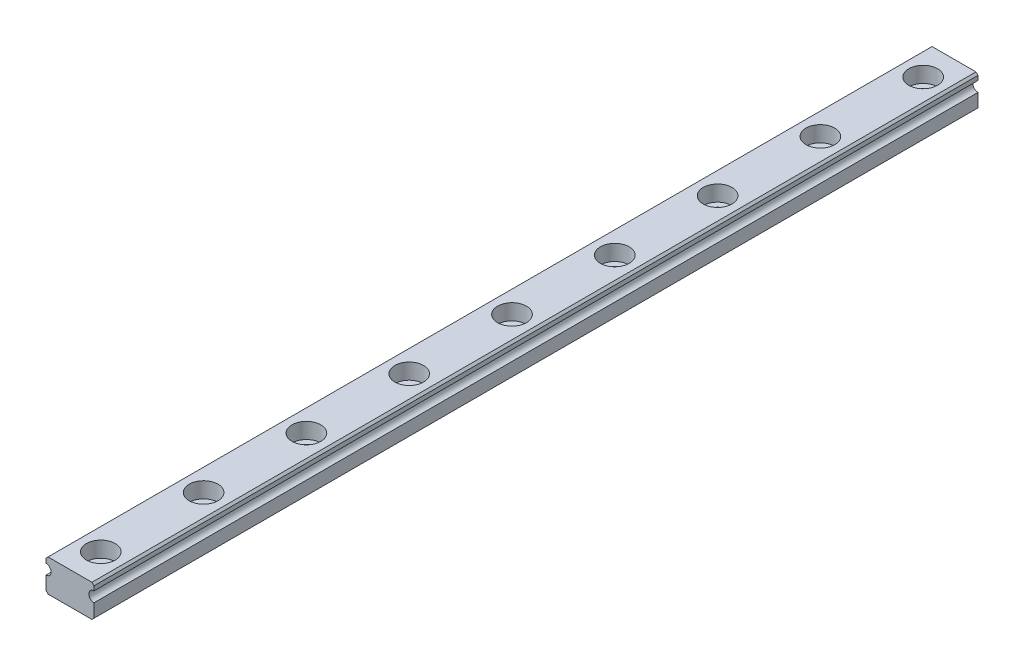
ISO-10303-21;
HEADER;
FILE_DESCRIPTION(('STEP AP214'),'2;1');
FILE_NAME('part.step','',(''),(''),'','','');
FILE_SCHEMA(('AUTOMOTIVE_DESIGN { 1 0 10303 214 1 1 1 1 }'));
ENDSEC;
DATA;
#1=APPLICATION_CONTEXT('core data for automotive mechanical design processes');
#2=APPLICATION_PROTOCOL_DEFINITION('international standard','automotive_design',2000,#1);
#3=PRODUCT_CONTEXT('',#1,'mechanical');
#4=PRODUCT('Part','Part','',(#3));
#5=PRODUCT_RELATED_PRODUCT_CATEGORY('part','',(#4));
#6=PRODUCT_DEFINITION_FORMATION('','',#4);
#7=PRODUCT_DEFINITION_CONTEXT('part definition',#1,'design');
#8=PRODUCT_DEFINITION('design','',#6,#7);
#9=PRODUCT_DEFINITION_SHAPE('','',#8);
#10=(LENGTH_UNIT() NAMED_UNIT(*) SI_UNIT(.MILLI.,.METRE.));
#11=(NAMED_UNIT(*) PLANE_ANGLE_UNIT() SI_UNIT($,.RADIAN.));
#12=(NAMED_UNIT(*) SI_UNIT($,.STERADIAN.) SOLID_ANGLE_UNIT());
#13=UNCERTAINTY_MEASURE_WITH_UNIT(LENGTH_MEASURE(1.E-05),#10,'distance_accuracy_value','');
#14=(GEOMETRIC_REPRESENTATION_CONTEXT(3) GLOBAL_UNCERTAINTY_ASSIGNED_CONTEXT((#13)) GLOBAL_UNIT_ASSIGNED_CONTEXT((#10,
#11,#12)) REPRESENTATION_CONTEXT('',''));
#15=CARTESIAN_POINT('',(0.,0.,0.));
#16=DIRECTION('',(0.,0.,1.));
#17=DIRECTION('',(1.,0.,0.));
#18=AXIS2_PLACEMENT_3D('',#15,#16,#17);
#19=CARTESIAN_POINT('',(-3.2,0.,129.));
#20=DIRECTION('',(0.,1.,0.));
#21=DIRECTION('',(0.,0.,1.));
#22=AXIS2_PLACEMENT_3D('',#19,#20,#21);
#23=PLANE('',#22);
#24=CARTESIAN_POINT('',(0.,0.,34.5));
#25=DIRECTION('',(0.,1.,0.));
#26=DIRECTION('',(0.,0.,1.));
#27=AXIS2_PLACEMENT_3D('',#24,#25,#26);
#28=CIRCLE('',#27,1.2);
#29=CARTESIAN_POINT('',(0.,0.,35.7));
#30=VERTEX_POINT('',#29);
#31=EDGE_CURVE('E267',#30,#30,#28,.T.);
#32=ORIENTED_EDGE('',*,*,#31,.T.);
#33=EDGE_LOOP('',(#32));
#34=FACE_BOUND('',#33,.T.);
#35=CARTESIAN_POINT('',(0.,0.,64.5));
#36=DIRECTION('',(0.,1.,0.));
#37=DIRECTION('',(0.,0.,1.));
#38=AXIS2_PLACEMENT_3D('',#35,#36,#37);
#39=CIRCLE('',#38,1.20000000000001);
#40=CARTESIAN_POINT('',(0.,0.,65.7));
#41=VERTEX_POINT('',#40);
#42=EDGE_CURVE('E296',#41,#41,#39,.T.);
#43=ORIENTED_EDGE('',*,*,#42,.T.);
#44=EDGE_LOOP('',(#43));
#45=FACE_BOUND('',#44,.T.);
#46=CARTESIAN_POINT('',(0.,0.,94.5));
#47=DIRECTION('',(0.,1.,0.));
#48=DIRECTION('',(0.,0.,1.));
#49=AXIS2_PLACEMENT_3D('',#46,#47,#48);
#50=CIRCLE('',#49,1.20000000000001);
#51=CARTESIAN_POINT('',(0.,0.,95.7));
#52=VERTEX_POINT('',#51);
#53=EDGE_CURVE('E318',#52,#52,#50,.T.);
#54=ORIENTED_EDGE('',*,*,#53,.T.);
#55=EDGE_LOOP('',(#54));
#56=FACE_BOUND('',#55,.T.);
#57=CARTESIAN_POINT('',(0.,0.,124.5));
#58=DIRECTION('',(0.,1.,0.));
#59=DIRECTION('',(0.,0.,1.));
#60=AXIS2_PLACEMENT_3D('',#57,#58,#59);
#61=CIRCLE('',#60,1.20000000000001);
#62=CARTESIAN_POINT('',(0.,0.,125.7));
#63=VERTEX_POINT('',#62);
#64=EDGE_CURVE('E340',#63,#63,#61,.T.);
#65=ORIENTED_EDGE('',*,*,#64,.T.);
#66=EDGE_LOOP('',(#65));
#67=FACE_BOUND('',#66,.T.);
#68=DIRECTION('',(1.,0.,0.));
#69=VECTOR('',#68,1.);
#70=CARTESIAN_POINT('',(-3.2,0.,0.));
#71=LINE('',#70,#69);
#72=CARTESIAN_POINT('',(-3.2,0.,0.));
#73=VERTEX_POINT('',#72);
#74=CARTESIAN_POINT('',(3.2,0.,0.));
#75=VERTEX_POINT('',#74);
#76=EDGE_CURVE('E165',#73,#75,#71,.T.);
#77=ORIENTED_EDGE('',*,*,#76,.T.);
#78=DIRECTION('',(0.,0.,-1.));
#79=VECTOR('',#78,1.);
#80=CARTESIAN_POINT('',(3.2,0.,129.));
#81=LINE('',#80,#79);
#82=CARTESIAN_POINT('',(3.2,0.,129.));
#83=VERTEX_POINT('',#82);
#84=EDGE_CURVE('E186',#83,#75,#81,.T.);
#85=ORIENTED_EDGE('',*,*,#84,.F.);
#86=DIRECTION('',(1.,0.,0.));
#87=VECTOR('',#86,1.);
#88=CARTESIAN_POINT('',(-3.2,0.,129.));
#89=LINE('',#88,#87);
#90=CARTESIAN_POINT('',(-3.2,0.,129.));
#91=VERTEX_POINT('',#90);
#92=EDGE_CURVE('E220',#91,#83,#89,.T.);
#93=ORIENTED_EDGE('',*,*,#92,.F.);
#94=DIRECTION('',(0.,0.,-1.));
#95=VECTOR('',#94,1.);
#96=CARTESIAN_POINT('',(-3.2,0.,129.));
#97=LINE('',#96,#95);
#98=EDGE_CURVE('E189',#91,#73,#97,.T.);
#99=ORIENTED_EDGE('',*,*,#98,.T.);
#100=EDGE_LOOP('',(#77,#85,#93,#99));
#101=FACE_BOUND('',#100,.T.);
#102=CARTESIAN_POINT('',(0.,0.,4.5));
#103=DIRECTION('',(0.,1.,0.));
#104=DIRECTION('',(0.,0.,1.));
#105=AXIS2_PLACEMENT_3D('',#102,#103,#104);
#106=CIRCLE('',#105,1.2);
#107=CARTESIAN_POINT('',(0.,0.,5.7));
#108=VERTEX_POINT('',#107);
#109=EDGE_CURVE('E352',#108,#108,#106,.T.);
#110=ORIENTED_EDGE('',*,*,#109,.T.);
#111=EDGE_LOOP('',(#110));
#112=FACE_BOUND('',#111,.T.);
#113=CARTESIAN_POINT('',(0.,0.,109.5));
#114=DIRECTION('',(0.,1.,0.));
#115=DIRECTION('',(0.,0.,1.));
#116=AXIS2_PLACEMENT_3D('',#113,#114,#115);
#117=CIRCLE('',#116,1.20000000000001);
#118=CARTESIAN_POINT('',(0.,0.,110.7));
#119=VERTEX_POINT('',#118);
#120=EDGE_CURVE('E330',#119,#119,#117,.T.);
#121=ORIENTED_EDGE('',*,*,#120,.T.);
#122=EDGE_LOOP('',(#121));
#123=FACE_BOUND('',#122,.T.);
#124=CARTESIAN_POINT('',(0.,0.,79.5));
#125=DIRECTION('',(0.,1.,0.));
#126=DIRECTION('',(0.,0.,1.));
#127=AXIS2_PLACEMENT_3D('',#124,#125,#126);
#128=CIRCLE('',#127,1.20000000000001);
#129=CARTESIAN_POINT('',(0.,0.,80.7));
#130=VERTEX_POINT('',#129);
#131=EDGE_CURVE('E308',#130,#130,#128,.T.);
#132=ORIENTED_EDGE('',*,*,#131,.T.);
#133=EDGE_LOOP('',(#132));
#134=FACE_BOUND('',#133,.T.);
#135=CARTESIAN_POINT('',(0.,0.,49.5));
#136=DIRECTION('',(0.,1.,0.));
#137=DIRECTION('',(0.,0.,1.));
#138=AXIS2_PLACEMENT_3D('',#135,#136,#137);
#139=CIRCLE('',#138,1.2);
#140=CARTESIAN_POINT('',(0.,0.,50.7));
#141=VERTEX_POINT('',#140);
#142=EDGE_CURVE('E286',#141,#141,#139,.T.);
#143=ORIENTED_EDGE('',*,*,#142,.T.);
#144=EDGE_LOOP('',(#143));
#145=FACE_BOUND('',#144,.T.);
#146=CARTESIAN_POINT('',(0.,0.,19.5));
#147=DIRECTION('',(0.,1.,0.));
#148=DIRECTION('',(0.,0.,1.));
#149=AXIS2_PLACEMENT_3D('',#146,#147,#148);
#150=CIRCLE('',#149,1.2);
#151=CARTESIAN_POINT('',(0.,0.,20.7));
#152=VERTEX_POINT('',#151);
#153=EDGE_CURVE('E395',#152,#152,#150,.T.);
#154=ORIENTED_EDGE('',*,*,#153,.T.);
#155=EDGE_LOOP('',(#154));
#156=FACE_BOUND('',#155,.T.);
#157=ADVANCED_FACE('F32',(#34,#45,#56,#67,#101,#112,#123,#134,#145,#156),#23,.F.);
#158=CARTESIAN_POINT('',(3.2030151519017,4.7,129.));
#159=DIRECTION('',(0.,-1.,0.));
#160=DIRECTION('',(0.,0.,-1.));
#161=AXIS2_PLACEMENT_3D('',#158,#159,#160);
#162=PLANE('',#161);
#163=CARTESIAN_POINT('',(0.,4.7,34.5));
#164=DIRECTION('',(0.,1.,0.));
#165=DIRECTION('',(0.,0.,1.));
#166=AXIS2_PLACEMENT_3D('',#163,#164,#165);
#167=CIRCLE('',#166,2.1);
#168=CARTESIAN_POINT('',(0.,4.7,36.6));
#169=VERTEX_POINT('',#168);
#170=EDGE_CURVE('E283',#169,#169,#167,.T.);
#171=ORIENTED_EDGE('',*,*,#170,.F.);
#172=EDGE_LOOP('',(#171));
#173=FACE_BOUND('',#172,.T.);
#174=CARTESIAN_POINT('',(0.,4.7,64.5));
#175=DIRECTION('',(0.,1.,0.));
#176=DIRECTION('',(0.,0.,1.));
#177=AXIS2_PLACEMENT_3D('',#174,#175,#176);
#178=CIRCLE('',#177,2.1);
#179=CARTESIAN_POINT('',(0.,4.7,66.6));
#180=VERTEX_POINT('',#179);
#181=EDGE_CURVE('E305',#180,#180,#178,.T.);
#182=ORIENTED_EDGE('',*,*,#181,.F.);
#183=EDGE_LOOP('',(#182));
#184=FACE_BOUND('',#183,.T.);
#185=CARTESIAN_POINT('',(0.,4.7,94.5));
#186=DIRECTION('',(0.,1.,0.));
#187=DIRECTION('',(0.,0.,1.));
#188=AXIS2_PLACEMENT_3D('',#185,#186,#187);
#189=CIRCLE('',#188,2.1);
#190=CARTESIAN_POINT('',(0.,4.7,96.6));
#191=VERTEX_POINT('',#190);
#192=EDGE_CURVE('E327',#191,#191,#189,.T.);
#193=ORIENTED_EDGE('',*,*,#192,.F.);
#194=EDGE_LOOP('',(#193));
#195=FACE_BOUND('',#194,.T.);
#196=CARTESIAN_POINT('',(0.,4.7,124.5));
#197=DIRECTION('',(0.,1.,0.));
#198=DIRECTION('',(0.,0.,1.));
#199=AXIS2_PLACEMENT_3D('',#196,#197,#198);
#200=CIRCLE('',#199,2.1);
#201=CARTESIAN_POINT('',(0.,4.7,126.6));
#202=VERTEX_POINT('',#201);
#203=EDGE_CURVE('E349',#202,#202,#200,.T.);
#204=ORIENTED_EDGE('',*,*,#203,.F.);
#205=EDGE_LOOP('',(#204));
#206=FACE_BOUND('',#205,.T.);
#207=DIRECTION('',(-1.,0.,0.));
#208=VECTOR('',#207,1.);
#209=CARTESIAN_POINT('',(3.2030151519017,4.7,0.));
#210=LINE('',#209,#208);
#211=CARTESIAN_POINT('',(3.2030151519017,4.7,0.));
#212=VERTEX_POINT('',#211);
#213=CARTESIAN_POINT('',(-3.2030151519017,4.7,0.));
#214=VERTEX_POINT('',#213);
#215=EDGE_CURVE('E96',#212,#214,#210,.T.);
#216=ORIENTED_EDGE('',*,*,#215,.T.);
#217=DIRECTION('',(0.,0.,-1.));
#218=VECTOR('',#217,1.);
#219=CARTESIAN_POINT('',(-3.2030151519017,4.7,129.));
#220=LINE('',#219,#218);
#221=CARTESIAN_POINT('',(-3.2030151519017,4.7,129.));
#222=VERTEX_POINT('',#221);
#223=EDGE_CURVE('E149',#222,#214,#220,.T.);
#224=ORIENTED_EDGE('',*,*,#223,.F.);
#225=DIRECTION('',(-1.,0.,0.));
#226=VECTOR('',#225,1.);
#227=CARTESIAN_POINT('',(3.2030151519017,4.7,129.));
#228=LINE('',#227,#226);
#229=CARTESIAN_POINT('',(3.2030151519017,4.7,129.));
#230=VERTEX_POINT('',#229);
#231=EDGE_CURVE('E49',#230,#222,#228,.T.);
#232=ORIENTED_EDGE('',*,*,#231,.F.);
#233=DIRECTION('',(0.,0.,-1.));
#234=VECTOR('',#233,1.);
#235=CARTESIAN_POINT('',(3.2030151519017,4.7,129.));
#236=LINE('',#235,#234);
#237=EDGE_CURVE('E145',#230,#212,#236,.T.);
#238=ORIENTED_EDGE('',*,*,#237,.T.);
#239=EDGE_LOOP('',(#216,#224,#232,#238));
#240=FACE_BOUND('',#239,.T.);
#241=CARTESIAN_POINT('',(0.,4.7,4.5));
#242=DIRECTION('',(0.,1.,0.));
#243=DIRECTION('',(0.,0.,1.));
#244=AXIS2_PLACEMENT_3D('',#241,#242,#243);
#245=CIRCLE('',#244,2.1);
#246=CARTESIAN_POINT('',(0.,4.7,6.6));
#247=VERTEX_POINT('',#246);
#248=EDGE_CURVE('E157',#247,#247,#245,.T.);
#249=ORIENTED_EDGE('',*,*,#248,.F.);
#250=EDGE_LOOP('',(#249));
#251=FACE_BOUND('',#250,.T.);
#252=CARTESIAN_POINT('',(0.,4.7,109.5));
#253=DIRECTION('',(0.,1.,0.));
#254=DIRECTION('',(0.,0.,1.));
#255=AXIS2_PLACEMENT_3D('',#252,#253,#254);
#256=CIRCLE('',#255,2.1);
#257=CARTESIAN_POINT('',(0.,4.7,111.6));
#258=VERTEX_POINT('',#257);
#259=EDGE_CURVE('E254',#258,#258,#256,.T.);
#260=ORIENTED_EDGE('',*,*,#259,.F.);
#261=EDGE_LOOP('',(#260));
#262=FACE_BOUND('',#261,.T.);
#263=CARTESIAN_POINT('',(0.,4.7,79.5));
#264=DIRECTION('',(0.,1.,0.));
#265=DIRECTION('',(0.,0.,1.));
#266=AXIS2_PLACEMENT_3D('',#263,#264,#265);
#267=CIRCLE('',#266,2.1);
#268=CARTESIAN_POINT('',(0.,4.7,81.6));
#269=VERTEX_POINT('',#268);
#270=EDGE_CURVE('E258',#269,#269,#267,.T.);
#271=ORIENTED_EDGE('',*,*,#270,.F.);
#272=EDGE_LOOP('',(#271));
#273=FACE_BOUND('',#272,.T.);
#274=CARTESIAN_POINT('',(0.,4.7,49.5));
#275=DIRECTION('',(0.,1.,0.));
#276=DIRECTION('',(0.,0.,1.));
#277=AXIS2_PLACEMENT_3D('',#274,#275,#276);
#278=CIRCLE('',#277,2.1);
#279=CARTESIAN_POINT('',(0.,4.7,51.6));
#280=VERTEX_POINT('',#279);
#281=EDGE_CURVE('E262',#280,#280,#278,.T.);
#282=ORIENTED_EDGE('',*,*,#281,.F.);
#283=EDGE_LOOP('',(#282));
#284=FACE_BOUND('',#283,.T.);
#285=CARTESIAN_POINT('',(0.,4.7,19.5));
#286=DIRECTION('',(0.,1.,0.));
#287=DIRECTION('',(0.,0.,1.));
#288=AXIS2_PLACEMENT_3D('',#285,#286,#287);
#289=CIRCLE('',#288,2.1);
#290=CARTESIAN_POINT('',(0.,4.7,21.6));
#291=VERTEX_POINT('',#290);
#292=EDGE_CURVE('E265',#291,#291,#289,.T.);
#293=ORIENTED_EDGE('',*,*,#292,.F.);
#294=EDGE_LOOP('',(#293));
#295=FACE_BOUND('',#294,.T.);
#296=ADVANCED_FACE('F243',(#173,#184,#195,#206,#240,#251,#262,#273,#284,#295),#162,.F.);
#297=CARTESIAN_POINT('',(-3.2030151519017,4.7,129.));
#298=DIRECTION('',(0.707106781186547,-0.707106781186547,0.));
#299=DIRECTION('',(0.707106781186548,0.707106781186548,0.));
#300=AXIS2_PLACEMENT_3D('',#297,#298,#299);
#301=PLANE('',#300);
#302=DIRECTION('',(-0.707106781186547,-0.707106781186547,0.));
#303=VECTOR('',#302,1.);
#304=CARTESIAN_POINT('',(-3.2030151519017,4.7,0.));
#305=LINE('',#304,#303);
#306=CARTESIAN_POINT('',(-3.5,4.4030151519017,0.));
#307=VERTEX_POINT('',#306);
#308=EDGE_CURVE('E153',#214,#307,#305,.T.);
#309=ORIENTED_EDGE('',*,*,#308,.T.);
#310=DIRECTION('',(0.,0.,-1.));
#311=VECTOR('',#310,1.);
#312=CARTESIAN_POINT('',(-3.5,4.4030151519017,129.));
#313=LINE('',#312,#311);
#314=CARTESIAN_POINT('',(-3.5,4.4030151519017,129.));
#315=VERTEX_POINT('',#314);
#316=EDGE_CURVE('E11',#315,#307,#313,.T.);
#317=ORIENTED_EDGE('',*,*,#316,.F.);
#318=DIRECTION('',(-0.707106781186547,-0.707106781186547,0.));
#319=VECTOR('',#318,1.);
#320=CARTESIAN_POINT('',(-3.2030151519017,4.7,129.));
#321=LINE('',#320,#319);
#322=EDGE_CURVE('E176',#222,#315,#321,.T.);
#323=ORIENTED_EDGE('',*,*,#322,.F.);
#324=ORIENTED_EDGE('',*,*,#223,.T.);
#325=EDGE_LOOP('',(#309,#317,#323,#324));
#326=FACE_BOUND('',#325,.T.);
#327=ADVANCED_FACE('F34',(#326),#301,.F.);
#328=CARTESIAN_POINT('',(-3.5,4.4030151519017,129.));
#329=DIRECTION('',(1.,0.,0.));
#330=DIRECTION('',(0.,0.,-1.));
#331=AXIS2_PLACEMENT_3D('',#328,#329,#330);
#332=PLANE('',#331);
#333=DIRECTION('',(0.,-1.,0.));
#334=VECTOR('',#333,1.);
#335=CARTESIAN_POINT('',(-3.5,4.4030151519017,0.));
#336=LINE('',#335,#334);
#337=CARTESIAN_POINT('',(-3.5,3.76,0.));
#338=VERTEX_POINT('',#337);
#339=EDGE_CURVE('E156',#307,#338,#336,.T.);
#340=ORIENTED_EDGE('',*,*,#339,.T.);
#341=DIRECTION('',(0.,0.,-1.));
#342=VECTOR('',#341,1.);
#343=CARTESIAN_POINT('',(-3.5,3.76,129.));
#344=LINE('',#343,#342);
#345=CARTESIAN_POINT('',(-3.5,3.76,129.));
#346=VERTEX_POINT('',#345);
#347=EDGE_CURVE('E41',#346,#338,#344,.T.);
#348=ORIENTED_EDGE('',*,*,#347,.F.);
#349=DIRECTION('',(0.,-1.,0.));
#350=VECTOR('',#349,1.);
#351=CARTESIAN_POINT('',(-3.5,4.4030151519017,129.));
#352=LINE('',#351,#350);
#353=EDGE_CURVE('E104',#315,#346,#352,.T.);
#354=ORIENTED_EDGE('',*,*,#353,.F.);
#355=ORIENTED_EDGE('',*,*,#316,.T.);
#356=EDGE_LOOP('',(#340,#348,#354,#355));
#357=FACE_BOUND('',#356,.T.);
#358=ADVANCED_FACE('F519',(#357),#332,.F.);
#359=CARTESIAN_POINT('',(-3.5,3.01,129.));
#360=DIRECTION('',(0.,0.,-1.));
#361=DIRECTION('',(-1.,0.,0.));
#362=AXIS2_PLACEMENT_3D('',#359,#360,#361);
#363=CYLINDRICAL_SURFACE('',#362,0.75);
#364=CARTESIAN_POINT('',(-3.5,3.01,0.));
#365=DIRECTION('',(0.,0.,-1.));
#366=DIRECTION('',(-1.,0.,0.));
#367=AXIS2_PLACEMENT_3D('',#364,#365,#366);
#368=CIRCLE('',#367,0.75);
#369=CARTESIAN_POINT('',(-3.5,2.26,0.));
#370=VERTEX_POINT('',#369);
#371=EDGE_CURVE('E159',#338,#370,#368,.T.);
#372=ORIENTED_EDGE('',*,*,#371,.T.);
#373=DIRECTION('',(0.,0.,-1.));
#374=VECTOR('',#373,1.);
#375=CARTESIAN_POINT('',(-3.5,2.26,129.));
#376=LINE('',#375,#374);
#377=CARTESIAN_POINT('',(-3.5,2.26,129.));
#378=VERTEX_POINT('',#377);
#379=EDGE_CURVE('E195',#378,#370,#376,.T.);
#380=ORIENTED_EDGE('',*,*,#379,.F.);
#381=CARTESIAN_POINT('',(-3.5,3.01,129.));
#382=DIRECTION('',(0.,0.,-1.));
#383=DIRECTION('',(-1.,0.,0.));
#384=AXIS2_PLACEMENT_3D('',#381,#382,#383);
#385=CIRCLE('',#384,0.75);
#386=EDGE_CURVE('E203',#346,#378,#385,.T.);
#387=ORIENTED_EDGE('',*,*,#386,.F.);
#388=ORIENTED_EDGE('',*,*,#347,.T.);
#389=EDGE_LOOP('',(#372,#380,#387,#388));
#390=FACE_BOUND('',#389,.T.);
#391=ADVANCED_FACE('F201',(#390),#363,.F.);
#392=CARTESIAN_POINT('',(-3.5,2.26,129.));
#393=DIRECTION('',(1.,0.,0.));
#394=DIRECTION('',(0.,0.,-1.));
#395=AXIS2_PLACEMENT_3D('',#392,#393,#394);
#396=PLANE('',#395);
#397=DIRECTION('',(0.,-1.,0.));
#398=VECTOR('',#397,1.);
#399=CARTESIAN_POINT('',(-3.5,2.26,0.));
#400=LINE('',#399,#398);
#401=CARTESIAN_POINT('',(-3.5,0.3,0.));
#402=VERTEX_POINT('',#401);
#403=EDGE_CURVE('E161',#370,#402,#400,.T.);
#404=ORIENTED_EDGE('',*,*,#403,.T.);
#405=DIRECTION('',(0.,0.,-1.));
#406=VECTOR('',#405,1.);
#407=CARTESIAN_POINT('',(-3.5,0.3,129.));
#408=LINE('',#407,#406);
#409=CARTESIAN_POINT('',(-3.5,0.3,129.));
#410=VERTEX_POINT('',#409);
#411=EDGE_CURVE('E192',#410,#402,#408,.T.);
#412=ORIENTED_EDGE('',*,*,#411,.F.);
#413=DIRECTION('',(0.,-1.,0.));
#414=VECTOR('',#413,1.);
#415=CARTESIAN_POINT('',(-3.5,2.26,129.));
#416=LINE('',#415,#414);
#417=EDGE_CURVE('E221',#378,#410,#416,.T.);
#418=ORIENTED_EDGE('',*,*,#417,.F.);
#419=ORIENTED_EDGE('',*,*,#379,.T.);
#420=EDGE_LOOP('',(#404,#412,#418,#419));
#421=FACE_BOUND('',#420,.T.);
#422=ADVANCED_FACE('F212',(#421),#396,.F.);
#423=CARTESIAN_POINT('',(-3.5,0.3,129.));
#424=DIRECTION('',(0.707106781186548,0.707106781186547,0.));
#425=DIRECTION('',(-0.707106781186547,0.707106781186548,0.));
#426=AXIS2_PLACEMENT_3D('',#423,#424,#425);
#427=PLANE('',#426);
#428=DIRECTION('',(0.707106781186547,-0.707106781186548,0.));
#429=VECTOR('',#428,1.);
#430=CARTESIAN_POINT('',(-3.5,0.3,0.));
#431=LINE('',#430,#429);
#432=EDGE_CURVE('E163',#402,#73,#431,.T.);
#433=ORIENTED_EDGE('',*,*,#432,.T.);
#434=ORIENTED_EDGE('',*,*,#98,.F.);
#435=DIRECTION('',(0.707106781186547,-0.707106781186548,0.));
#436=VECTOR('',#435,1.);
#437=CARTESIAN_POINT('',(-3.5,0.3,129.));
#438=LINE('',#437,#436);
#439=EDGE_CURVE('E218',#410,#91,#438,.T.);
#440=ORIENTED_EDGE('',*,*,#439,.F.);
#441=ORIENTED_EDGE('',*,*,#411,.T.);
#442=EDGE_LOOP('',(#433,#434,#440,#441));
#443=FACE_BOUND('',#442,.T.);
#444=ADVANCED_FACE('F216',(#443),#427,.F.);
#445=CARTESIAN_POINT('',(3.2,0.,129.));
#446=DIRECTION('',(-0.707106781186548,0.707106781186547,0.));
#447=DIRECTION('',(-0.707106781186547,-0.707106781186548,0.));
#448=AXIS2_PLACEMENT_3D('',#445,#446,#447);
#449=PLANE('',#448);
#450=DIRECTION('',(0.707106781186547,0.707106781186548,0.));
#451=VECTOR('',#450,1.);
#452=CARTESIAN_POINT('',(3.2,0.,0.));
#453=LINE('',#452,#451);
#454=CARTESIAN_POINT('',(3.5,0.3,0.));
#455=VERTEX_POINT('',#454);
#456=EDGE_CURVE('E167',#75,#455,#453,.T.);
#457=ORIENTED_EDGE('',*,*,#456,.T.);
#458=DIRECTION('',(0.,0.,-1.));
#459=VECTOR('',#458,1.);
#460=CARTESIAN_POINT('',(3.5,0.3,129.));
#461=LINE('',#460,#459);
#462=CARTESIAN_POINT('',(3.5,0.3,129.));
#463=VERTEX_POINT('',#462);
#464=EDGE_CURVE('E183',#463,#455,#461,.T.);
#465=ORIENTED_EDGE('',*,*,#464,.F.);
#466=DIRECTION('',(0.707106781186547,0.707106781186548,0.));
#467=VECTOR('',#466,1.);
#468=CARTESIAN_POINT('',(3.2,0.,129.));
#469=LINE('',#468,#467);
#470=EDGE_CURVE('E223',#83,#463,#469,.T.);
#471=ORIENTED_EDGE('',*,*,#470,.F.);
#472=ORIENTED_EDGE('',*,*,#84,.T.);
#473=EDGE_LOOP('',(#457,#465,#471,#472));
#474=FACE_BOUND('',#473,.T.);
#475=ADVANCED_FACE('F510',(#474),#449,.F.);
#476=CARTESIAN_POINT('',(3.5,0.3,129.));
#477=DIRECTION('',(-1.,0.,0.));
#478=DIRECTION('',(0.,0.,1.));
#479=AXIS2_PLACEMENT_3D('',#476,#477,#478);
#480=PLANE('',#479);
#481=DIRECTION('',(0.,1.,0.));
#482=VECTOR('',#481,1.);
#483=CARTESIAN_POINT('',(3.5,0.3,0.));
#484=LINE('',#483,#482);
#485=CARTESIAN_POINT('',(3.5,2.26,0.));
#486=VERTEX_POINT('',#485);
#487=EDGE_CURVE('E169',#455,#486,#484,.T.);
#488=ORIENTED_EDGE('',*,*,#487,.T.);
#489=DIRECTION('',(0.,0.,-1.));
#490=VECTOR('',#489,1.);
#491=CARTESIAN_POINT('',(3.5,2.26,129.));
#492=LINE('',#491,#490);
#493=CARTESIAN_POINT('',(3.5,2.26,129.));
#494=VERTEX_POINT('',#493);
#495=EDGE_CURVE('E180',#494,#486,#492,.T.);
#496=ORIENTED_EDGE('',*,*,#495,.F.);
#497=DIRECTION('',(0.,1.,0.));
#498=VECTOR('',#497,1.);
#499=CARTESIAN_POINT('',(3.5,0.3,129.));
#500=LINE('',#499,#498);
#501=EDGE_CURVE('E229',#463,#494,#500,.T.);
#502=ORIENTED_EDGE('',*,*,#501,.F.);
#503=ORIENTED_EDGE('',*,*,#464,.T.);
#504=EDGE_LOOP('',(#488,#496,#502,#503));
#505=FACE_BOUND('',#504,.T.);
#506=ADVANCED_FACE('F235',(#505),#480,.F.);
#507=CARTESIAN_POINT('',(3.5,3.01,129.));
#508=DIRECTION('',(0.,0.,-1.));
#509=DIRECTION('',(-1.,0.,0.));
#510=AXIS2_PLACEMENT_3D('',#507,#508,#509);
#511=CYLINDRICAL_SURFACE('',#510,0.75);
#512=CARTESIAN_POINT('',(3.5,3.01,0.));
#513=DIRECTION('',(0.,0.,-1.));
#514=DIRECTION('',(-1.,0.,0.));
#515=AXIS2_PLACEMENT_3D('',#512,#513,#514);
#516=CIRCLE('',#515,0.75);
#517=CARTESIAN_POINT('',(3.5,3.76,0.));
#518=VERTEX_POINT('',#517);
#519=EDGE_CURVE('E171',#486,#518,#516,.T.);
#520=ORIENTED_EDGE('',*,*,#519,.T.);
#521=DIRECTION('',(0.,0.,-1.));
#522=VECTOR('',#521,1.);
#523=CARTESIAN_POINT('',(3.5,3.76,129.));
#524=LINE('',#523,#522);
#525=CARTESIAN_POINT('',(3.5,3.76,129.));
#526=VERTEX_POINT('',#525);
#527=EDGE_CURVE('E144',#526,#518,#524,.T.);
#528=ORIENTED_EDGE('',*,*,#527,.F.);
#529=CARTESIAN_POINT('',(3.5,3.01,129.));
#530=DIRECTION('',(0.,0.,-1.));
#531=DIRECTION('',(-1.,0.,0.));
#532=AXIS2_PLACEMENT_3D('',#529,#530,#531);
#533=CIRCLE('',#532,0.75);
#534=EDGE_CURVE('E135',#494,#526,#533,.T.);
#535=ORIENTED_EDGE('',*,*,#534,.F.);
#536=ORIENTED_EDGE('',*,*,#495,.T.);
#537=EDGE_LOOP('',(#520,#528,#535,#536));
#538=FACE_BOUND('',#537,.T.);
#539=ADVANCED_FACE('F239',(#538),#511,.F.);
#540=CARTESIAN_POINT('',(3.5,3.76,129.));
#541=DIRECTION('',(-1.,0.,0.));
#542=DIRECTION('',(0.,0.,1.));
#543=AXIS2_PLACEMENT_3D('',#540,#541,#542);
#544=PLANE('',#543);
#545=DIRECTION('',(0.,1.,0.));
#546=VECTOR('',#545,1.);
#547=CARTESIAN_POINT('',(3.5,3.76,0.));
#548=LINE('',#547,#546);
#549=CARTESIAN_POINT('',(3.5,4.4030151519016,0.));
#550=VERTEX_POINT('',#549);
#551=EDGE_CURVE('E143',#518,#550,#548,.T.);
#552=ORIENTED_EDGE('',*,*,#551,.T.);
#553=DIRECTION('',(0.,0.,-1.));
#554=VECTOR('',#553,1.);
#555=CARTESIAN_POINT('',(3.5,4.4030151519016,129.));
#556=LINE('',#555,#554);
#557=CARTESIAN_POINT('',(3.5,4.4030151519016,129.));
#558=VERTEX_POINT('',#557);
#559=EDGE_CURVE('E140',#558,#550,#556,.T.);
#560=ORIENTED_EDGE('',*,*,#559,.F.);
#561=DIRECTION('',(0.,1.,0.));
#562=VECTOR('',#561,1.);
#563=CARTESIAN_POINT('',(3.5,3.76,129.));
#564=LINE('',#563,#562);
#565=EDGE_CURVE('E129',#526,#558,#564,.T.);
#566=ORIENTED_EDGE('',*,*,#565,.F.);
#567=ORIENTED_EDGE('',*,*,#527,.T.);
#568=EDGE_LOOP('',(#552,#560,#566,#567));
#569=FACE_BOUND('',#568,.T.);
#570=ADVANCED_FACE('F141',(#569),#544,.F.);
#571=CARTESIAN_POINT('',(3.5,4.4030151519016,129.));
#572=DIRECTION('',(-0.707106781186666,-0.707106781186429,0.));
#573=DIRECTION('',(0.707106781186429,-0.707106781186666,0.));
#574=AXIS2_PLACEMENT_3D('',#571,#572,#573);
#575=PLANE('',#574);
#576=DIRECTION('',(-0.707106781186429,0.707106781186666,0.));
#577=VECTOR('',#576,1.);
#578=CARTESIAN_POINT('',(3.5,4.4030151519016,0.));
#579=LINE('',#578,#577);
#580=EDGE_CURVE('E90',#550,#212,#579,.T.);
#581=ORIENTED_EDGE('',*,*,#580,.T.);
#582=ORIENTED_EDGE('',*,*,#237,.F.);
#583=DIRECTION('',(-0.707106781186429,0.707106781186666,0.));
#584=VECTOR('',#583,1.);
#585=CARTESIAN_POINT('',(3.5,4.4030151519016,129.));
#586=LINE('',#585,#584);
#587=EDGE_CURVE('E133',#558,#230,#586,.T.);
#588=ORIENTED_EDGE('',*,*,#587,.F.);
#589=ORIENTED_EDGE('',*,*,#559,.T.);
#590=EDGE_LOOP('',(#581,#582,#588,#589));
#591=FACE_BOUND('',#590,.T.);
#592=ADVANCED_FACE('F147',(#591),#575,.F.);
#593=CARTESIAN_POINT('',(-3.5,3.01,129.));
#594=DIRECTION('',(0.,0.,-1.));
#595=DIRECTION('',(-1.,0.,0.));
#596=AXIS2_PLACEMENT_3D('',#593,#594,#595);
#597=PLANE('',#596);
#598=ORIENTED_EDGE('',*,*,#322,.T.);
#599=ORIENTED_EDGE('',*,*,#353,.T.);
#600=ORIENTED_EDGE('',*,*,#386,.T.);
#601=ORIENTED_EDGE('',*,*,#417,.T.);
#602=ORIENTED_EDGE('',*,*,#439,.T.);
#603=ORIENTED_EDGE('',*,*,#92,.T.);
#604=ORIENTED_EDGE('',*,*,#470,.T.);
#605=ORIENTED_EDGE('',*,*,#501,.T.);
#606=ORIENTED_EDGE('',*,*,#534,.T.);
#607=ORIENTED_EDGE('',*,*,#565,.T.);
#608=ORIENTED_EDGE('',*,*,#587,.T.);
#609=ORIENTED_EDGE('',*,*,#231,.T.);
#610=EDGE_LOOP('',(#598,#599,#600,#601,#602,#603,#604,#605,#606,#607,#608,#609));
#611=FACE_BOUND('',#610,.T.);
#612=ADVANCED_FACE('F131',(#611),#597,.F.);
#613=CARTESIAN_POINT('',(-3.5,3.01,0.));
#614=DIRECTION('',(0.,0.,-1.));
#615=DIRECTION('',(-1.,0.,0.));
#616=AXIS2_PLACEMENT_3D('',#613,#614,#615);
#617=PLANE('',#616);
#618=ORIENTED_EDGE('',*,*,#308,.F.);
#619=ORIENTED_EDGE('',*,*,#215,.F.);
#620=ORIENTED_EDGE('',*,*,#580,.F.);
#621=ORIENTED_EDGE('',*,*,#551,.F.);
#622=ORIENTED_EDGE('',*,*,#519,.F.);
#623=ORIENTED_EDGE('',*,*,#487,.F.);
#624=ORIENTED_EDGE('',*,*,#456,.F.);
#625=ORIENTED_EDGE('',*,*,#76,.F.);
#626=ORIENTED_EDGE('',*,*,#432,.F.);
#627=ORIENTED_EDGE('',*,*,#403,.F.);
#628=ORIENTED_EDGE('',*,*,#371,.F.);
#629=ORIENTED_EDGE('',*,*,#339,.F.);
#630=EDGE_LOOP('',(#618,#619,#620,#621,#622,#623,#624,#625,#626,#627,#628,#629));
#631=FACE_BOUND('',#630,.T.);
#632=ADVANCED_FACE('F207',(#631),#617,.T.);
#633=CARTESIAN_POINT('',(0.,0.,4.5));
#634=DIRECTION('',(0.,1.,0.));
#635=DIRECTION('',(0.,0.,1.));
#636=AXIS2_PLACEMENT_3D('',#633,#634,#635);
#637=CYLINDRICAL_SURFACE('',#636,2.1);
#638=ORIENTED_EDGE('',*,*,#248,.T.);
#639=EDGE_LOOP('',(#638));
#640=FACE_BOUND('',#639,.T.);
#641=CARTESIAN_POINT('',(0.,2.4,4.5));
#642=DIRECTION('',(0.,1.,0.));
#643=DIRECTION('',(0.,0.,1.));
#644=AXIS2_PLACEMENT_3D('',#641,#642,#643);
#645=CIRCLE('',#644,2.1);
#646=CARTESIAN_POINT('',(0.,2.4,6.6));
#647=VERTEX_POINT('',#646);
#648=EDGE_CURVE('E358',#647,#647,#645,.T.);
#649=ORIENTED_EDGE('',*,*,#648,.F.);
#650=EDGE_LOOP('',(#649));
#651=FACE_BOUND('',#650,.T.);
#652=ADVANCED_FACE('F364',(#640,#651),#637,.F.);
#653=CARTESIAN_POINT('',(0.,2.4,2.4));
#654=DIRECTION('',(0.,1.,0.));
#655=DIRECTION('',(0.,0.,1.));
#656=AXIS2_PLACEMENT_3D('',#653,#654,#655);
#657=PLANE('',#656);
#658=ORIENTED_EDGE('',*,*,#648,.T.);
#659=EDGE_LOOP('',(#658));
#660=FACE_BOUND('',#659,.T.);
#661=CARTESIAN_POINT('',(0.,2.4,4.5));
#662=DIRECTION('',(0.,1.,0.));
#663=DIRECTION('',(0.,0.,1.));
#664=AXIS2_PLACEMENT_3D('',#661,#662,#663);
#665=CIRCLE('',#664,1.2);
#666=CARTESIAN_POINT('',(0.,2.4,5.7));
#667=VERTEX_POINT('',#666);
#668=EDGE_CURVE('E355',#667,#667,#665,.T.);
#669=ORIENTED_EDGE('',*,*,#668,.F.);
#670=EDGE_LOOP('',(#669));
#671=FACE_BOUND('',#670,.T.);
#672=ADVANCED_FACE('F367',(#660,#671),#657,.T.);
#673=CARTESIAN_POINT('',(0.,0.,4.5));
#674=DIRECTION('',(0.,1.,0.));
#675=DIRECTION('',(0.,0.,1.));
#676=AXIS2_PLACEMENT_3D('',#673,#674,#675);
#677=CYLINDRICAL_SURFACE('',#676,1.2);
#678=ORIENTED_EDGE('',*,*,#668,.T.);
#679=EDGE_LOOP('',(#678));
#680=FACE_BOUND('',#679,.T.);
#681=ORIENTED_EDGE('',*,*,#109,.F.);
#682=EDGE_LOOP('',(#681));
#683=FACE_BOUND('',#682,.T.);
#684=ADVANCED_FACE('F373',(#680,#683),#677,.F.);
#685=CARTESIAN_POINT('',(0.,0.,124.5));
#686=DIRECTION('',(0.,1.,0.));
#687=DIRECTION('',(0.,0.,1.));
#688=AXIS2_PLACEMENT_3D('',#685,#686,#687);
#689=CYLINDRICAL_SURFACE('',#688,2.1);
#690=ORIENTED_EDGE('',*,*,#203,.T.);
#691=EDGE_LOOP('',(#690));
#692=FACE_BOUND('',#691,.T.);
#693=CARTESIAN_POINT('',(0.,2.4,124.5));
#694=DIRECTION('',(0.,1.,0.));
#695=DIRECTION('',(0.,0.,1.));
#696=AXIS2_PLACEMENT_3D('',#693,#694,#695);
#697=CIRCLE('',#696,2.1);
#698=CARTESIAN_POINT('',(0.,2.4,126.6));
#699=VERTEX_POINT('',#698);
#700=EDGE_CURVE('E346',#699,#699,#697,.T.);
#701=ORIENTED_EDGE('',*,*,#700,.F.);
#702=EDGE_LOOP('',(#701));
#703=FACE_BOUND('',#702,.T.);
#704=ADVANCED_FACE('F379',(#692,#703),#689,.F.);
#705=CARTESIAN_POINT('',(0.,2.4,122.4));
#706=DIRECTION('',(0.,1.,0.));
#707=DIRECTION('',(0.,0.,1.));
#708=AXIS2_PLACEMENT_3D('',#705,#706,#707);
#709=PLANE('',#708);
#710=ORIENTED_EDGE('',*,*,#700,.T.);
#711=EDGE_LOOP('',(#710));
#712=FACE_BOUND('',#711,.T.);
#713=CARTESIAN_POINT('',(0.,2.4,124.5));
#714=DIRECTION('',(0.,1.,0.));
#715=DIRECTION('',(0.,0.,1.));
#716=AXIS2_PLACEMENT_3D('',#713,#714,#715);
#717=CIRCLE('',#716,1.20000000000001);
#718=CARTESIAN_POINT('',(0.,2.4,125.7));
#719=VERTEX_POINT('',#718);
#720=EDGE_CURVE('E343',#719,#719,#717,.T.);
#721=ORIENTED_EDGE('',*,*,#720,.F.);
#722=EDGE_LOOP('',(#721));
#723=FACE_BOUND('',#722,.T.);
#724=ADVANCED_FACE('F490',(#712,#723),#709,.T.);
#725=CARTESIAN_POINT('',(0.,0.,124.5));
#726=DIRECTION('',(0.,1.,0.));
#727=DIRECTION('',(0.,0.,1.));
#728=AXIS2_PLACEMENT_3D('',#725,#726,#727);
#729=CYLINDRICAL_SURFACE('',#728,1.20000000000001);
#730=ORIENTED_EDGE('',*,*,#720,.T.);
#731=EDGE_LOOP('',(#730));
#732=FACE_BOUND('',#731,.T.);
#733=ORIENTED_EDGE('',*,*,#64,.F.);
#734=EDGE_LOOP('',(#733));
#735=FACE_BOUND('',#734,.T.);
#736=ADVANCED_FACE('F486',(#732,#735),#729,.F.);
#737=CARTESIAN_POINT('',(0.,0.,109.5));
#738=DIRECTION('',(0.,1.,0.));
#739=DIRECTION('',(0.,0.,1.));
#740=AXIS2_PLACEMENT_3D('',#737,#738,#739);
#741=CYLINDRICAL_SURFACE('',#740,2.1);
#742=ORIENTED_EDGE('',*,*,#259,.T.);
#743=EDGE_LOOP('',(#742));
#744=FACE_BOUND('',#743,.T.);
#745=CARTESIAN_POINT('',(0.,2.4,109.5));
#746=DIRECTION('',(0.,1.,0.));
#747=DIRECTION('',(0.,0.,1.));
#748=AXIS2_PLACEMENT_3D('',#745,#746,#747);
#749=CIRCLE('',#748,2.1);
#750=CARTESIAN_POINT('',(0.,2.4,111.6));
#751=VERTEX_POINT('',#750);
#752=EDGE_CURVE('E336',#751,#751,#749,.T.);
#753=ORIENTED_EDGE('',*,*,#752,.F.);
#754=EDGE_LOOP('',(#753));
#755=FACE_BOUND('',#754,.T.);
#756=ADVANCED_FACE('F482',(#744,#755),#741,.F.);
#757=CARTESIAN_POINT('',(0.,2.4,107.4));
#758=DIRECTION('',(0.,1.,0.));
#759=DIRECTION('',(0.,0.,1.));
#760=AXIS2_PLACEMENT_3D('',#757,#758,#759);
#761=PLANE('',#760);
#762=ORIENTED_EDGE('',*,*,#752,.T.);
#763=EDGE_LOOP('',(#762));
#764=FACE_BOUND('',#763,.T.);
#765=CARTESIAN_POINT('',(0.,2.4,109.5));
#766=DIRECTION('',(0.,1.,0.));
#767=DIRECTION('',(0.,0.,1.));
#768=AXIS2_PLACEMENT_3D('',#765,#766,#767);
#769=CIRCLE('',#768,1.20000000000001);
#770=CARTESIAN_POINT('',(0.,2.4,110.7));
#771=VERTEX_POINT('',#770);
#772=EDGE_CURVE('E333',#771,#771,#769,.T.);
#773=ORIENTED_EDGE('',*,*,#772,.F.);
#774=EDGE_LOOP('',(#773));
#775=FACE_BOUND('',#774,.T.);
#776=ADVANCED_FACE('F478',(#764,#775),#761,.T.);
#777=CARTESIAN_POINT('',(0.,0.,109.5));
#778=DIRECTION('',(0.,1.,0.));
#779=DIRECTION('',(0.,0.,1.));
#780=AXIS2_PLACEMENT_3D('',#777,#778,#779);
#781=CYLINDRICAL_SURFACE('',#780,1.20000000000001);
#782=ORIENTED_EDGE('',*,*,#772,.T.);
#783=EDGE_LOOP('',(#782));
#784=FACE_BOUND('',#783,.T.);
#785=ORIENTED_EDGE('',*,*,#120,.F.);
#786=EDGE_LOOP('',(#785));
#787=FACE_BOUND('',#786,.T.);
#788=ADVANCED_FACE('F474',(#784,#787),#781,.F.);
#789=CARTESIAN_POINT('',(0.,0.,94.5));
#790=DIRECTION('',(0.,1.,0.));
#791=DIRECTION('',(0.,0.,1.));
#792=AXIS2_PLACEMENT_3D('',#789,#790,#791);
#793=CYLINDRICAL_SURFACE('',#792,2.1);
#794=ORIENTED_EDGE('',*,*,#192,.T.);
#795=EDGE_LOOP('',(#794));
#796=FACE_BOUND('',#795,.T.);
#797=CARTESIAN_POINT('',(0.,2.4,94.5));
#798=DIRECTION('',(0.,1.,0.));
#799=DIRECTION('',(0.,0.,1.));
#800=AXIS2_PLACEMENT_3D('',#797,#798,#799);
#801=CIRCLE('',#800,2.1);
#802=CARTESIAN_POINT('',(0.,2.4,96.6));
#803=VERTEX_POINT('',#802);
#804=EDGE_CURVE('E324',#803,#803,#801,.T.);
#805=ORIENTED_EDGE('',*,*,#804,.F.);
#806=EDGE_LOOP('',(#805));
#807=FACE_BOUND('',#806,.T.);
#808=ADVANCED_FACE('F470',(#796,#807),#793,.F.);
#809=CARTESIAN_POINT('',(0.,2.4,92.4));
#810=DIRECTION('',(0.,1.,0.));
#811=DIRECTION('',(0.,0.,1.));
#812=AXIS2_PLACEMENT_3D('',#809,#810,#811);
#813=PLANE('',#812);
#814=ORIENTED_EDGE('',*,*,#804,.T.);
#815=EDGE_LOOP('',(#814));
#816=FACE_BOUND('',#815,.T.);
#817=CARTESIAN_POINT('',(0.,2.4,94.5));
#818=DIRECTION('',(0.,1.,0.));
#819=DIRECTION('',(0.,0.,1.));
#820=AXIS2_PLACEMENT_3D('',#817,#818,#819);
#821=CIRCLE('',#820,1.20000000000001);
#822=CARTESIAN_POINT('',(0.,2.4,95.7));
#823=VERTEX_POINT('',#822);
#824=EDGE_CURVE('E321',#823,#823,#821,.T.);
#825=ORIENTED_EDGE('',*,*,#824,.F.);
#826=EDGE_LOOP('',(#825));
#827=FACE_BOUND('',#826,.T.);
#828=ADVANCED_FACE('F466',(#816,#827),#813,.T.);
#829=CARTESIAN_POINT('',(0.,0.,94.5));
#830=DIRECTION('',(0.,1.,0.));
#831=DIRECTION('',(0.,0.,1.));
#832=AXIS2_PLACEMENT_3D('',#829,#830,#831);
#833=CYLINDRICAL_SURFACE('',#832,1.20000000000001);
#834=ORIENTED_EDGE('',*,*,#824,.T.);
#835=EDGE_LOOP('',(#834));
#836=FACE_BOUND('',#835,.T.);
#837=ORIENTED_EDGE('',*,*,#53,.F.);
#838=EDGE_LOOP('',(#837));
#839=FACE_BOUND('',#838,.T.);
#840=ADVANCED_FACE('F462',(#836,#839),#833,.F.);
#841=CARTESIAN_POINT('',(0.,0.,79.5));
#842=DIRECTION('',(0.,1.,0.));
#843=DIRECTION('',(0.,0.,1.));
#844=AXIS2_PLACEMENT_3D('',#841,#842,#843);
#845=CYLINDRICAL_SURFACE('',#844,2.1);
#846=ORIENTED_EDGE('',*,*,#270,.T.);
#847=EDGE_LOOP('',(#846));
#848=FACE_BOUND('',#847,.T.);
#849=CARTESIAN_POINT('',(0.,2.4,79.5));
#850=DIRECTION('',(0.,1.,0.));
#851=DIRECTION('',(0.,0.,1.));
#852=AXIS2_PLACEMENT_3D('',#849,#850,#851);
#853=CIRCLE('',#852,2.1);
#854=CARTESIAN_POINT('',(0.,2.4,81.6));
#855=VERTEX_POINT('',#854);
#856=EDGE_CURVE('E314',#855,#855,#853,.T.);
#857=ORIENTED_EDGE('',*,*,#856,.F.);
#858=EDGE_LOOP('',(#857));
#859=FACE_BOUND('',#858,.T.);
#860=ADVANCED_FACE('F458',(#848,#859),#845,.F.);
#861=CARTESIAN_POINT('',(0.,2.4,77.4));
#862=DIRECTION('',(0.,1.,0.));
#863=DIRECTION('',(0.,0.,1.));
#864=AXIS2_PLACEMENT_3D('',#861,#862,#863);
#865=PLANE('',#864);
#866=ORIENTED_EDGE('',*,*,#856,.T.);
#867=EDGE_LOOP('',(#866));
#868=FACE_BOUND('',#867,.T.);
#869=CARTESIAN_POINT('',(0.,2.4,79.5));
#870=DIRECTION('',(0.,1.,0.));
#871=DIRECTION('',(0.,0.,1.));
#872=AXIS2_PLACEMENT_3D('',#869,#870,#871);
#873=CIRCLE('',#872,1.20000000000001);
#874=CARTESIAN_POINT('',(0.,2.4,80.7));
#875=VERTEX_POINT('',#874);
#876=EDGE_CURVE('E311',#875,#875,#873,.T.);
#877=ORIENTED_EDGE('',*,*,#876,.F.);
#878=EDGE_LOOP('',(#877));
#879=FACE_BOUND('',#878,.T.);
#880=ADVANCED_FACE('F454',(#868,#879),#865,.T.);
#881=CARTESIAN_POINT('',(0.,0.,79.5));
#882=DIRECTION('',(0.,1.,0.));
#883=DIRECTION('',(0.,0.,1.));
#884=AXIS2_PLACEMENT_3D('',#881,#882,#883);
#885=CYLINDRICAL_SURFACE('',#884,1.20000000000001);
#886=ORIENTED_EDGE('',*,*,#876,.T.);
#887=EDGE_LOOP('',(#886));
#888=FACE_BOUND('',#887,.T.);
#889=ORIENTED_EDGE('',*,*,#131,.F.);
#890=EDGE_LOOP('',(#889));
#891=FACE_BOUND('',#890,.T.);
#892=ADVANCED_FACE('F450',(#888,#891),#885,.F.);
#893=CARTESIAN_POINT('',(0.,0.,64.5));
#894=DIRECTION('',(0.,1.,0.));
#895=DIRECTION('',(0.,0.,1.));
#896=AXIS2_PLACEMENT_3D('',#893,#894,#895);
#897=CYLINDRICAL_SURFACE('',#896,2.1);
#898=ORIENTED_EDGE('',*,*,#181,.T.);
#899=EDGE_LOOP('',(#898));
#900=FACE_BOUND('',#899,.T.);
#901=CARTESIAN_POINT('',(0.,2.4,64.5));
#902=DIRECTION('',(0.,1.,0.));
#903=DIRECTION('',(0.,0.,1.));
#904=AXIS2_PLACEMENT_3D('',#901,#902,#903);
#905=CIRCLE('',#904,2.1);
#906=CARTESIAN_POINT('',(0.,2.4,66.6));
#907=VERTEX_POINT('',#906);
#908=EDGE_CURVE('E302',#907,#907,#905,.T.);
#909=ORIENTED_EDGE('',*,*,#908,.F.);
#910=EDGE_LOOP('',(#909));
#911=FACE_BOUND('',#910,.T.);
#912=ADVANCED_FACE('F446',(#900,#911),#897,.F.);
#913=CARTESIAN_POINT('',(0.,2.4,62.4));
#914=DIRECTION('',(0.,1.,0.));
#915=DIRECTION('',(0.,0.,1.));
#916=AXIS2_PLACEMENT_3D('',#913,#914,#915);
#917=PLANE('',#916);
#918=ORIENTED_EDGE('',*,*,#908,.T.);
#919=EDGE_LOOP('',(#918));
#920=FACE_BOUND('',#919,.T.);
#921=CARTESIAN_POINT('',(0.,2.4,64.5));
#922=DIRECTION('',(0.,1.,0.));
#923=DIRECTION('',(0.,0.,1.));
#924=AXIS2_PLACEMENT_3D('',#921,#922,#923);
#925=CIRCLE('',#924,1.20000000000001);
#926=CARTESIAN_POINT('',(0.,2.4,65.7));
#927=VERTEX_POINT('',#926);
#928=EDGE_CURVE('E299',#927,#927,#925,.T.);
#929=ORIENTED_EDGE('',*,*,#928,.F.);
#930=EDGE_LOOP('',(#929));
#931=FACE_BOUND('',#930,.T.);
#932=ADVANCED_FACE('F442',(#920,#931),#917,.T.);
#933=CARTESIAN_POINT('',(0.,0.,64.5));
#934=DIRECTION('',(0.,1.,0.));
#935=DIRECTION('',(0.,0.,1.));
#936=AXIS2_PLACEMENT_3D('',#933,#934,#935);
#937=CYLINDRICAL_SURFACE('',#936,1.20000000000001);
#938=ORIENTED_EDGE('',*,*,#928,.T.);
#939=EDGE_LOOP('',(#938));
#940=FACE_BOUND('',#939,.T.);
#941=ORIENTED_EDGE('',*,*,#42,.F.);
#942=EDGE_LOOP('',(#941));
#943=FACE_BOUND('',#942,.T.);
#944=ADVANCED_FACE('F438',(#940,#943),#937,.F.);
#945=CARTESIAN_POINT('',(0.,0.,49.5));
#946=DIRECTION('',(0.,1.,0.));
#947=DIRECTION('',(0.,0.,1.));
#948=AXIS2_PLACEMENT_3D('',#945,#946,#947);
#949=CYLINDRICAL_SURFACE('',#948,2.1);
#950=ORIENTED_EDGE('',*,*,#281,.T.);
#951=EDGE_LOOP('',(#950));
#952=FACE_BOUND('',#951,.T.);
#953=CARTESIAN_POINT('',(0.,2.4,49.5));
#954=DIRECTION('',(0.,1.,0.));
#955=DIRECTION('',(0.,0.,1.));
#956=AXIS2_PLACEMENT_3D('',#953,#954,#955);
#957=CIRCLE('',#956,2.1);
#958=CARTESIAN_POINT('',(0.,2.4,51.6));
#959=VERTEX_POINT('',#958);
#960=EDGE_CURVE('E292',#959,#959,#957,.T.);
#961=ORIENTED_EDGE('',*,*,#960,.F.);
#962=EDGE_LOOP('',(#961));
#963=FACE_BOUND('',#962,.T.);
#964=ADVANCED_FACE('F434',(#952,#963),#949,.F.);
#965=CARTESIAN_POINT('',(0.,2.4,47.4));
#966=DIRECTION('',(0.,1.,0.));
#967=DIRECTION('',(0.,0.,1.));
#968=AXIS2_PLACEMENT_3D('',#965,#966,#967);
#969=PLANE('',#968);
#970=ORIENTED_EDGE('',*,*,#960,.T.);
#971=EDGE_LOOP('',(#970));
#972=FACE_BOUND('',#971,.T.);
#973=CARTESIAN_POINT('',(0.,2.4,49.5));
#974=DIRECTION('',(0.,1.,0.));
#975=DIRECTION('',(0.,0.,1.));
#976=AXIS2_PLACEMENT_3D('',#973,#974,#975);
#977=CIRCLE('',#976,1.2);
#978=CARTESIAN_POINT('',(0.,2.4,50.7));
#979=VERTEX_POINT('',#978);
#980=EDGE_CURVE('E289',#979,#979,#977,.T.);
#981=ORIENTED_EDGE('',*,*,#980,.F.);
#982=EDGE_LOOP('',(#981));
#983=FACE_BOUND('',#982,.T.);
#984=ADVANCED_FACE('F430',(#972,#983),#969,.T.);
#985=CARTESIAN_POINT('',(0.,0.,49.5));
#986=DIRECTION('',(0.,1.,0.));
#987=DIRECTION('',(0.,0.,1.));
#988=AXIS2_PLACEMENT_3D('',#985,#986,#987);
#989=CYLINDRICAL_SURFACE('',#988,1.2);
#990=ORIENTED_EDGE('',*,*,#980,.T.);
#991=EDGE_LOOP('',(#990));
#992=FACE_BOUND('',#991,.T.);
#993=ORIENTED_EDGE('',*,*,#142,.F.);
#994=EDGE_LOOP('',(#993));
#995=FACE_BOUND('',#994,.T.);
#996=ADVANCED_FACE('F426',(#992,#995),#989,.F.);
#997=CARTESIAN_POINT('',(0.,0.,34.5));
#998=DIRECTION('',(0.,1.,0.));
#999=DIRECTION('',(0.,0.,1.));
#1000=AXIS2_PLACEMENT_3D('',#997,#998,#999);
#1001=CYLINDRICAL_SURFACE('',#1000,2.1);
#1002=ORIENTED_EDGE('',*,*,#170,.T.);
#1003=EDGE_LOOP('',(#1002));
#1004=FACE_BOUND('',#1003,.T.);
#1005=CARTESIAN_POINT('',(0.,2.4,34.5));
#1006=DIRECTION('',(0.,1.,0.));
#1007=DIRECTION('',(0.,0.,1.));
#1008=AXIS2_PLACEMENT_3D('',#1005,#1006,#1007);
#1009=CIRCLE('',#1008,2.1);
#1010=CARTESIAN_POINT('',(0.,2.4,36.6));
#1011=VERTEX_POINT('',#1010);
#1012=EDGE_CURVE('E280',#1011,#1011,#1009,.T.);
#1013=ORIENTED_EDGE('',*,*,#1012,.F.);
#1014=EDGE_LOOP('',(#1013));
#1015=FACE_BOUND('',#1014,.T.);
#1016=ADVANCED_FACE('F422',(#1004,#1015),#1001,.F.);
#1017=CARTESIAN_POINT('',(0.,2.4,32.4));
#1018=DIRECTION('',(0.,1.,0.));
#1019=DIRECTION('',(0.,0.,1.));
#1020=AXIS2_PLACEMENT_3D('',#1017,#1018,#1019);
#1021=PLANE('',#1020);
#1022=ORIENTED_EDGE('',*,*,#1012,.T.);
#1023=EDGE_LOOP('',(#1022));
#1024=FACE_BOUND('',#1023,.T.);
#1025=CARTESIAN_POINT('',(0.,2.4,34.5));
#1026=DIRECTION('',(0.,1.,0.));
#1027=DIRECTION('',(0.,0.,1.));
#1028=AXIS2_PLACEMENT_3D('',#1025,#1026,#1027);
#1029=CIRCLE('',#1028,1.2);
#1030=CARTESIAN_POINT('',(0.,2.4,35.7));
#1031=VERTEX_POINT('',#1030);
#1032=EDGE_CURVE('E271',#1031,#1031,#1029,.T.);
#1033=ORIENTED_EDGE('',*,*,#1032,.F.);
#1034=EDGE_LOOP('',(#1033));
#1035=FACE_BOUND('',#1034,.T.);
#1036=ADVANCED_FACE('F418',(#1024,#1035),#1021,.T.);
#1037=CARTESIAN_POINT('',(0.,0.,34.5));
#1038=DIRECTION('',(0.,1.,0.));
#1039=DIRECTION('',(0.,0.,1.));
#1040=AXIS2_PLACEMENT_3D('',#1037,#1038,#1039);
#1041=CYLINDRICAL_SURFACE('',#1040,1.2);
#1042=ORIENTED_EDGE('',*,*,#1032,.T.);
#1043=EDGE_LOOP('',(#1042));
#1044=FACE_BOUND('',#1043,.T.);
#1045=ORIENTED_EDGE('',*,*,#31,.F.);
#1046=EDGE_LOOP('',(#1045));
#1047=FACE_BOUND('',#1046,.T.);
#1048=ADVANCED_FACE('F413',(#1044,#1047),#1041,.F.);
#1049=CARTESIAN_POINT('',(0.,0.,19.5));
#1050=DIRECTION('',(0.,1.,0.));
#1051=DIRECTION('',(0.,0.,1.));
#1052=AXIS2_PLACEMENT_3D('',#1049,#1050,#1051);
#1053=CYLINDRICAL_SURFACE('',#1052,2.1);
#1054=ORIENTED_EDGE('',*,*,#292,.T.);
#1055=EDGE_LOOP('',(#1054));
#1056=FACE_BOUND('',#1055,.T.);
#1057=CARTESIAN_POINT('',(0.,2.4,19.5));
#1058=DIRECTION('',(0.,1.,0.));
#1059=DIRECTION('',(0.,0.,1.));
#1060=AXIS2_PLACEMENT_3D('',#1057,#1058,#1059);
#1061=CIRCLE('',#1060,2.1);
#1062=CARTESIAN_POINT('',(0.,2.4,21.6));
#1063=VERTEX_POINT('',#1062);
#1064=EDGE_CURVE('E268',#1063,#1063,#1061,.T.);
#1065=ORIENTED_EDGE('',*,*,#1064,.F.);
#1066=EDGE_LOOP('',(#1065));
#1067=FACE_BOUND('',#1066,.T.);
#1068=ADVANCED_FACE('F405',(#1056,#1067),#1053,.F.);
#1069=CARTESIAN_POINT('',(0.,2.4,17.4));
#1070=DIRECTION('',(0.,1.,0.));
#1071=DIRECTION('',(0.,0.,1.));
#1072=AXIS2_PLACEMENT_3D('',#1069,#1070,#1071);
#1073=PLANE('',#1072);
#1074=ORIENTED_EDGE('',*,*,#1064,.T.);
#1075=EDGE_LOOP('',(#1074));
#1076=FACE_BOUND('',#1075,.T.);
#1077=CARTESIAN_POINT('',(0.,2.4,19.5));
#1078=DIRECTION('',(0.,1.,0.));
#1079=DIRECTION('',(0.,0.,1.));
#1080=AXIS2_PLACEMENT_3D('',#1077,#1078,#1079);
#1081=CIRCLE('',#1080,1.2);
#1082=CARTESIAN_POINT('',(0.,2.4,20.7));
#1083=VERTEX_POINT('',#1082);
#1084=EDGE_CURVE('E274',#1083,#1083,#1081,.T.);
#1085=ORIENTED_EDGE('',*,*,#1084,.F.);
#1086=EDGE_LOOP('',(#1085));
#1087=FACE_BOUND('',#1086,.T.);
#1088=ADVANCED_FACE('F403',(#1076,#1087),#1073,.T.);
#1089=CARTESIAN_POINT('',(0.,0.,19.5));
#1090=DIRECTION('',(0.,1.,0.));
#1091=DIRECTION('',(0.,0.,1.));
#1092=AXIS2_PLACEMENT_3D('',#1089,#1090,#1091);
#1093=CYLINDRICAL_SURFACE('',#1092,1.2);
#1094=ORIENTED_EDGE('',*,*,#1084,.T.);
#1095=EDGE_LOOP('',(#1094));
#1096=FACE_BOUND('',#1095,.T.);
#1097=ORIENTED_EDGE('',*,*,#153,.F.);
#1098=EDGE_LOOP('',(#1097));
#1099=FACE_BOUND('',#1098,.T.);
#1100=ADVANCED_FACE('F401',(#1096,#1099),#1093,.F.);
#1101=CLOSED_SHELL('',(#157,#296,#327,#358,#391,#422,#444,#475,#506,#539,#570,#592,#612,#632,
#652,#672,#684,#704,#724,#736,#756,#776,#788,#808,#828,#840,#860,#880,#892,#912,#932,#944,#964,
#984,#996,#1016,#1036,#1048,#1068,#1088,#1100));
#1102=MANIFOLD_SOLID_BREP('B2',#1101);
#1103=ADVANCED_BREP_SHAPE_REPRESENTATION('',(#18,#1102),#14);
#1104=SHAPE_DEFINITION_REPRESENTATION(#9,#1103);
ENDSEC;
END-ISO-10303-21;
